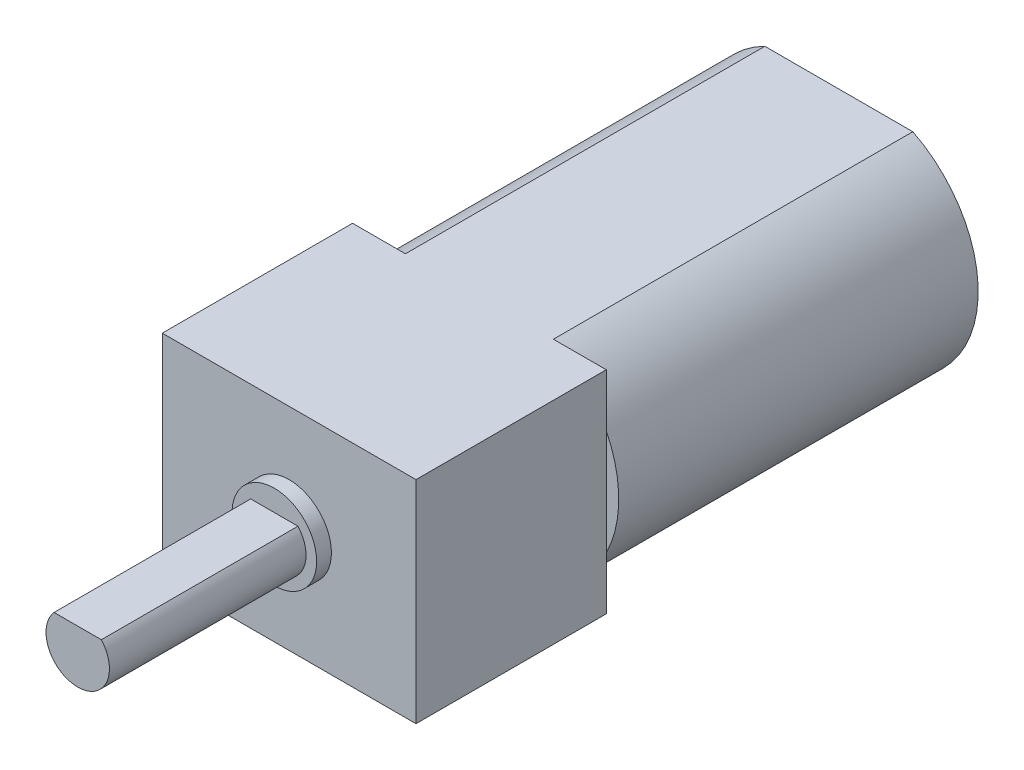
ISO-10303-21;
HEADER;
FILE_DESCRIPTION(('STEP AP214'),'2;1');
FILE_NAME('part.step','',(''),(''),'','','');
FILE_SCHEMA(('AUTOMOTIVE_DESIGN { 1 0 10303 214 1 1 1 1 }'));
ENDSEC;
DATA;
#1=APPLICATION_CONTEXT('core data for automotive mechanical design processes');
#2=APPLICATION_PROTOCOL_DEFINITION('international standard','automotive_design',2000,#1);
#3=PRODUCT_CONTEXT('',#1,'mechanical');
#4=PRODUCT('Part','Part','',(#3));
#5=PRODUCT_RELATED_PRODUCT_CATEGORY('part','',(#4));
#6=PRODUCT_DEFINITION_FORMATION('','',#4);
#7=PRODUCT_DEFINITION_CONTEXT('part definition',#1,'design');
#8=PRODUCT_DEFINITION('design','',#6,#7);
#9=PRODUCT_DEFINITION_SHAPE('','',#8);
#10=(LENGTH_UNIT() NAMED_UNIT(*) SI_UNIT(.MILLI.,.METRE.));
#11=(NAMED_UNIT(*) PLANE_ANGLE_UNIT() SI_UNIT($,.RADIAN.));
#12=(NAMED_UNIT(*) SI_UNIT($,.STERADIAN.) SOLID_ANGLE_UNIT());
#13=UNCERTAINTY_MEASURE_WITH_UNIT(LENGTH_MEASURE(1.E-05),#10,'distance_accuracy_value','');
#14=(GEOMETRIC_REPRESENTATION_CONTEXT(3) GLOBAL_UNCERTAINTY_ASSIGNED_CONTEXT((#13)) GLOBAL_UNIT_ASSIGNED_CONTEXT((#10,
#11,#12)) REPRESENTATION_CONTEXT('',''));
#15=CARTESIAN_POINT('',(0.,0.,0.));
#16=DIRECTION('',(0.,0.,1.));
#17=DIRECTION('',(1.,0.,0.));
#18=AXIS2_PLACEMENT_3D('',#15,#16,#17);
#19=CARTESIAN_POINT('',(-1.,0.,0.));
#20=DIRECTION('',(0.,0.,1.));
#21=DIRECTION('',(1.,0.,0.));
#22=AXIS2_PLACEMENT_3D('',#19,#20,#21);
#23=PLANE('',#22);
#24=DIRECTION('',(0.,1.,0.));
#25=VECTOR('',#24,1.);
#26=CARTESIAN_POINT('',(6.,5.,0.));
#27=LINE('',#26,#25);
#28=CARTESIAN_POINT('',(6.,-2.5,0.));
#29=VERTEX_POINT('',#28);
#30=CARTESIAN_POINT('',(6.,2.5,0.));
#31=VERTEX_POINT('',#30);
#32=EDGE_CURVE('E150',#29,#31,#27,.T.);
#33=ORIENTED_EDGE('',*,*,#32,.F.);
#34=CARTESIAN_POINT('',(1.,0.,0.));
#35=DIRECTION('',(0.,0.,1.));
#36=DIRECTION('',(-1.,0.,0.));
#37=AXIS2_PLACEMENT_3D('',#34,#35,#36);
#38=CIRCLE('',#37,5.59016994374947);
#39=EDGE_CURVE('E208',#29,#31,#38,.T.);
#40=ORIENTED_EDGE('',*,*,#39,.T.);
#41=EDGE_LOOP('',(#33,#40));
#42=FACE_BOUND('',#41,.T.);
#43=ADVANCED_FACE('F35',(#42),#23,.T.);
#44=CARTESIAN_POINT('',(-1.,0.,-17.));
#45=DIRECTION('',(0.,0.,1.));
#46=DIRECTION('',(1.,0.,0.));
#47=AXIS2_PLACEMENT_3D('',#44,#45,#46);
#48=CYLINDRICAL_SURFACE('',#47,5.59016994374947);
#49=CARTESIAN_POINT('',(-1.,0.,0.));
#50=DIRECTION('',(0.,0.,1.));
#51=DIRECTION('',(1.,0.,0.));
#52=AXIS2_PLACEMENT_3D('',#49,#50,#51);
#53=CIRCLE('',#52,5.59016994374947);
#54=CARTESIAN_POINT('',(-3.5,5.,0.));
#55=VERTEX_POINT('',#54);
#56=CARTESIAN_POINT('',(-6.,2.49999999999999,0.));
#57=VERTEX_POINT('',#56);
#58=EDGE_CURVE('E202',#55,#57,#53,.T.);
#59=ORIENTED_EDGE('',*,*,#58,.F.);
#60=DIRECTION('',(0.,0.,1.));
#61=VECTOR('',#60,1.);
#62=CARTESIAN_POINT('',(-3.5,5.,-17.));
#63=LINE('',#62,#61);
#64=CARTESIAN_POINT('',(-3.5,5.,-17.));
#65=VERTEX_POINT('',#64);
#66=EDGE_CURVE('E209',#65,#55,#63,.T.);
#67=ORIENTED_EDGE('',*,*,#66,.F.);
#68=CARTESIAN_POINT('',(-1.,0.,-17.));
#69=DIRECTION('',(0.,0.,1.));
#70=DIRECTION('',(1.,0.,0.));
#71=AXIS2_PLACEMENT_3D('',#68,#69,#70);
#72=CIRCLE('',#71,5.59016994374947);
#73=CARTESIAN_POINT('',(-3.5,-5.,-17.));
#74=VERTEX_POINT('',#73);
#75=EDGE_CURVE('E189',#65,#74,#72,.T.);
#76=ORIENTED_EDGE('',*,*,#75,.T.);
#77=DIRECTION('',(0.,0.,1.));
#78=VECTOR('',#77,1.);
#79=CARTESIAN_POINT('',(-3.5,-5.,-17.));
#80=LINE('',#79,#78);
#81=CARTESIAN_POINT('',(-3.5,-5.,0.));
#82=VERTEX_POINT('',#81);
#83=EDGE_CURVE('E39',#74,#82,#80,.T.);
#84=ORIENTED_EDGE('',*,*,#83,.T.);
#85=CARTESIAN_POINT('',(-6.,-2.5,0.));
#86=VERTEX_POINT('',#85);
#87=EDGE_CURVE('E188',#86,#82,#53,.T.);
#88=ORIENTED_EDGE('',*,*,#87,.F.);
#89=EDGE_CURVE('E205',#57,#86,#53,.T.);
#90=ORIENTED_EDGE('',*,*,#89,.F.);
#91=EDGE_LOOP('',(#59,#67,#76,#84,#88,#90));
#92=FACE_BOUND('',#91,.T.);
#93=ADVANCED_FACE('F37',(#92),#48,.T.);
#94=CARTESIAN_POINT('',(-3.5,5.,-17.));
#95=DIRECTION('',(0.,1.,0.));
#96=DIRECTION('',(0.,0.,1.));
#97=AXIS2_PLACEMENT_3D('',#94,#95,#96);
#98=PLANE('',#97);
#99=ORIENTED_EDGE('',*,*,#66,.T.);
#100=DIRECTION('',(-1.,0.,0.));
#101=VECTOR('',#100,1.);
#102=CARTESIAN_POINT('',(-6.,5.,0.));
#103=LINE('',#102,#101);
#104=CARTESIAN_POINT('',(-6.,5.,0.));
#105=VERTEX_POINT('',#104);
#106=EDGE_CURVE('E165',#55,#105,#103,.T.);
#107=ORIENTED_EDGE('',*,*,#106,.T.);
#108=DIRECTION('',(0.,0.,-1.));
#109=VECTOR('',#108,1.);
#110=CARTESIAN_POINT('',(-6.,5.,9.));
#111=LINE('',#110,#109);
#112=CARTESIAN_POINT('',(-6.,5.,9.));
#113=VERTEX_POINT('',#112);
#114=EDGE_CURVE('E182',#113,#105,#111,.T.);
#115=ORIENTED_EDGE('',*,*,#114,.F.);
#116=DIRECTION('',(-1.,0.,0.));
#117=VECTOR('',#116,1.);
#118=CARTESIAN_POINT('',(-6.,5.,9.));
#119=LINE('',#118,#117);
#120=CARTESIAN_POINT('',(6.,5.,9.));
#121=VERTEX_POINT('',#120);
#122=EDGE_CURVE('E154',#121,#113,#119,.T.);
#123=ORIENTED_EDGE('',*,*,#122,.F.);
#124=DIRECTION('',(0.,0.,-1.));
#125=VECTOR('',#124,1.);
#126=CARTESIAN_POINT('',(6.,5.,9.));
#127=LINE('',#126,#125);
#128=CARTESIAN_POINT('',(6.,5.,0.));
#129=VERTEX_POINT('',#128);
#130=EDGE_CURVE('E185',#121,#129,#127,.T.);
#131=ORIENTED_EDGE('',*,*,#130,.T.);
#132=CARTESIAN_POINT('',(3.5,5.,0.));
#133=VERTEX_POINT('',#132);
#134=EDGE_CURVE('E166',#129,#133,#103,.T.);
#135=ORIENTED_EDGE('',*,*,#134,.T.);
#136=DIRECTION('',(0.,0.,1.));
#137=VECTOR('',#136,1.);
#138=CARTESIAN_POINT('',(3.5,5.,-17.));
#139=LINE('',#138,#137);
#140=CARTESIAN_POINT('',(3.5,5.,-17.));
#141=VERTEX_POINT('',#140);
#142=EDGE_CURVE('E211',#141,#133,#139,.T.);
#143=ORIENTED_EDGE('',*,*,#142,.F.);
#144=DIRECTION('',(-1.,0.,0.));
#145=VECTOR('',#144,1.);
#146=CARTESIAN_POINT('',(-3.5,5.,-17.));
#147=LINE('',#146,#145);
#148=EDGE_CURVE('E199',#141,#65,#147,.T.);
#149=ORIENTED_EDGE('',*,*,#148,.T.);
#150=EDGE_LOOP('',(#99,#107,#115,#123,#131,#135,#143,#149));
#151=FACE_BOUND('',#150,.T.);
#152=ADVANCED_FACE('F244',(#151),#98,.T.);
#153=CARTESIAN_POINT('',(1.,0.,-17.));
#154=DIRECTION('',(0.,0.,1.));
#155=DIRECTION('',(1.,0.,0.));
#156=AXIS2_PLACEMENT_3D('',#153,#154,#155);
#157=CYLINDRICAL_SURFACE('',#156,5.59016994374947);
#158=CARTESIAN_POINT('',(3.5,-5.,0.));
#159=VERTEX_POINT('',#158);
#160=EDGE_CURVE('E193',#159,#29,#38,.T.);
#161=ORIENTED_EDGE('',*,*,#160,.F.);
#162=DIRECTION('',(0.,0.,1.));
#163=VECTOR('',#162,1.);
#164=CARTESIAN_POINT('',(3.5,-5.,-17.));
#165=LINE('',#164,#163);
#166=CARTESIAN_POINT('',(3.5,-5.,-17.));
#167=VERTEX_POINT('',#166);
#168=EDGE_CURVE('E212',#167,#159,#165,.T.);
#169=ORIENTED_EDGE('',*,*,#168,.F.);
#170=CARTESIAN_POINT('',(1.,0.,-17.));
#171=DIRECTION('',(0.,0.,1.));
#172=DIRECTION('',(-1.,0.,0.));
#173=AXIS2_PLACEMENT_3D('',#170,#171,#172);
#174=CIRCLE('',#173,5.59016994374947);
#175=EDGE_CURVE('E196',#167,#141,#174,.T.);
#176=ORIENTED_EDGE('',*,*,#175,.T.);
#177=ORIENTED_EDGE('',*,*,#142,.T.);
#178=EDGE_CURVE('E60',#31,#133,#38,.T.);
#179=ORIENTED_EDGE('',*,*,#178,.F.);
#180=ORIENTED_EDGE('',*,*,#39,.F.);
#181=EDGE_LOOP('',(#161,#169,#176,#177,#179,#180));
#182=FACE_BOUND('',#181,.T.);
#183=ADVANCED_FACE('F252',(#182),#157,.T.);
#184=CARTESIAN_POINT('',(-3.5,-5.,-17.));
#185=DIRECTION('',(0.,-1.,0.));
#186=DIRECTION('',(0.,0.,-1.));
#187=AXIS2_PLACEMENT_3D('',#184,#185,#186);
#188=PLANE('',#187);
#189=ORIENTED_EDGE('',*,*,#168,.T.);
#190=DIRECTION('',(1.,0.,0.));
#191=VECTOR('',#190,1.);
#192=CARTESIAN_POINT('',(-6.,-5.,0.));
#193=LINE('',#192,#191);
#194=CARTESIAN_POINT('',(6.,-5.,0.));
#195=VERTEX_POINT('',#194);
#196=EDGE_CURVE('E173',#159,#195,#193,.T.);
#197=ORIENTED_EDGE('',*,*,#196,.T.);
#198=DIRECTION('',(0.,0.,-1.));
#199=VECTOR('',#198,1.);
#200=CARTESIAN_POINT('',(6.,-5.,9.));
#201=LINE('',#200,#199);
#202=CARTESIAN_POINT('',(6.,-5.,9.));
#203=VERTEX_POINT('',#202);
#204=EDGE_CURVE('E161',#203,#195,#201,.T.);
#205=ORIENTED_EDGE('',*,*,#204,.F.);
#206=DIRECTION('',(1.,0.,0.));
#207=VECTOR('',#206,1.);
#208=CARTESIAN_POINT('',(-6.,-5.,9.));
#209=LINE('',#208,#207);
#210=CARTESIAN_POINT('',(-6.,-5.,9.));
#211=VERTEX_POINT('',#210);
#212=EDGE_CURVE('E159',#211,#203,#209,.T.);
#213=ORIENTED_EDGE('',*,*,#212,.F.);
#214=DIRECTION('',(0.,0.,-1.));
#215=VECTOR('',#214,1.);
#216=CARTESIAN_POINT('',(-6.,-5.,9.));
#217=LINE('',#216,#215);
#218=CARTESIAN_POINT('',(-6.,-5.,0.));
#219=VERTEX_POINT('',#218);
#220=EDGE_CURVE('E179',#211,#219,#217,.T.);
#221=ORIENTED_EDGE('',*,*,#220,.T.);
#222=EDGE_CURVE('E155',#219,#82,#193,.T.);
#223=ORIENTED_EDGE('',*,*,#222,.T.);
#224=ORIENTED_EDGE('',*,*,#83,.F.);
#225=DIRECTION('',(1.,0.,0.));
#226=VECTOR('',#225,1.);
#227=CARTESIAN_POINT('',(-3.5,-5.,-17.));
#228=LINE('',#227,#226);
#229=EDGE_CURVE('E192',#74,#167,#228,.T.);
#230=ORIENTED_EDGE('',*,*,#229,.T.);
#231=EDGE_LOOP('',(#189,#197,#205,#213,#221,#223,#224,#230));
#232=FACE_BOUND('',#231,.T.);
#233=ADVANCED_FACE('F227',(#232),#188,.T.);
#234=CARTESIAN_POINT('',(-1.,0.,-17.));
#235=DIRECTION('',(0.,0.,1.));
#236=DIRECTION('',(1.,0.,0.));
#237=AXIS2_PLACEMENT_3D('',#234,#235,#236);
#238=PLANE('',#237);
#239=ORIENTED_EDGE('',*,*,#75,.F.);
#240=ORIENTED_EDGE('',*,*,#148,.F.);
#241=ORIENTED_EDGE('',*,*,#175,.F.);
#242=ORIENTED_EDGE('',*,*,#229,.F.);
#243=EDGE_LOOP('',(#239,#240,#241,#242));
#244=FACE_BOUND('',#243,.T.);
#245=ADVANCED_FACE('F265',(#244),#238,.F.);
#246=DIRECTION('',(0.,-1.,0.));
#247=VECTOR('',#246,1.);
#248=CARTESIAN_POINT('',(-6.,5.,0.));
#249=LINE('',#248,#247);
#250=EDGE_CURVE('E174',#57,#86,#249,.T.);
#251=ORIENTED_EDGE('',*,*,#250,.F.);
#252=ORIENTED_EDGE('',*,*,#89,.T.);
#253=EDGE_LOOP('',(#251,#252));
#254=FACE_BOUND('',#253,.T.);
#255=ADVANCED_FACE('F257',(#254),#23,.T.);
#256=CARTESIAN_POINT('',(0.,0.,0.));
#257=DIRECTION('',(0.,0.,1.));
#258=DIRECTION('',(1.,0.,0.));
#259=AXIS2_PLACEMENT_3D('',#256,#257,#258);
#260=PLANE('',#259);
#261=ORIENTED_EDGE('',*,*,#106,.F.);
#262=ORIENTED_EDGE('',*,*,#58,.T.);
#263=EDGE_CURVE('E170',#105,#57,#249,.T.);
#264=ORIENTED_EDGE('',*,*,#263,.F.);
#265=EDGE_LOOP('',(#261,#262,#264));
#266=FACE_BOUND('',#265,.T.);
#267=ADVANCED_FACE('F264',(#266),#260,.F.);
#268=EDGE_CURVE('E169',#86,#219,#249,.T.);
#269=ORIENTED_EDGE('',*,*,#268,.F.);
#270=ORIENTED_EDGE('',*,*,#87,.T.);
#271=ORIENTED_EDGE('',*,*,#222,.F.);
#272=EDGE_LOOP('',(#269,#270,#271));
#273=FACE_BOUND('',#272,.T.);
#274=ADVANCED_FACE('F225',(#273),#260,.F.);
#275=ORIENTED_EDGE('',*,*,#196,.F.);
#276=ORIENTED_EDGE('',*,*,#160,.T.);
#277=EDGE_CURVE('E162',#195,#29,#27,.T.);
#278=ORIENTED_EDGE('',*,*,#277,.F.);
#279=EDGE_LOOP('',(#275,#276,#278));
#280=FACE_BOUND('',#279,.T.);
#281=ADVANCED_FACE('F251',(#280),#260,.F.);
#282=EDGE_CURVE('E143',#31,#129,#27,.T.);
#283=ORIENTED_EDGE('',*,*,#282,.F.);
#284=ORIENTED_EDGE('',*,*,#178,.T.);
#285=ORIENTED_EDGE('',*,*,#134,.F.);
#286=EDGE_LOOP('',(#283,#284,#285));
#287=FACE_BOUND('',#286,.T.);
#288=ADVANCED_FACE('F242',(#287),#260,.F.);
#289=CARTESIAN_POINT('',(6.,5.,9.));
#290=DIRECTION('',(-1.,0.,0.));
#291=DIRECTION('',(0.,-1.,0.));
#292=AXIS2_PLACEMENT_3D('',#289,#290,#291);
#293=PLANE('',#292);
#294=ORIENTED_EDGE('',*,*,#277,.T.);
#295=ORIENTED_EDGE('',*,*,#32,.T.);
#296=ORIENTED_EDGE('',*,*,#282,.T.);
#297=ORIENTED_EDGE('',*,*,#130,.F.);
#298=DIRECTION('',(0.,1.,0.));
#299=VECTOR('',#298,1.);
#300=CARTESIAN_POINT('',(6.,5.,9.));
#301=LINE('',#300,#299);
#302=EDGE_CURVE('E151',#203,#121,#301,.T.);
#303=ORIENTED_EDGE('',*,*,#302,.F.);
#304=ORIENTED_EDGE('',*,*,#204,.T.);
#305=EDGE_LOOP('',(#294,#295,#296,#297,#303,#304));
#306=FACE_BOUND('',#305,.T.);
#307=ADVANCED_FACE('F239',(#306),#293,.F.);
#308=CARTESIAN_POINT('',(-6.,5.,9.));
#309=DIRECTION('',(1.,0.,0.));
#310=DIRECTION('',(0.,1.,0.));
#311=AXIS2_PLACEMENT_3D('',#308,#309,#310);
#312=PLANE('',#311);
#313=ORIENTED_EDGE('',*,*,#263,.T.);
#314=ORIENTED_EDGE('',*,*,#250,.T.);
#315=ORIENTED_EDGE('',*,*,#268,.T.);
#316=ORIENTED_EDGE('',*,*,#220,.F.);
#317=DIRECTION('',(0.,-1.,0.));
#318=VECTOR('',#317,1.);
#319=CARTESIAN_POINT('',(-6.,5.,9.));
#320=LINE('',#319,#318);
#321=EDGE_CURVE('E157',#113,#211,#320,.T.);
#322=ORIENTED_EDGE('',*,*,#321,.F.);
#323=ORIENTED_EDGE('',*,*,#114,.T.);
#324=EDGE_LOOP('',(#313,#314,#315,#316,#322,#323));
#325=FACE_BOUND('',#324,.T.);
#326=ADVANCED_FACE('F233',(#325),#312,.F.);
#327=CARTESIAN_POINT('',(0.,0.,9.));
#328=DIRECTION('',(0.,0.,1.));
#329=DIRECTION('',(1.,0.,0.));
#330=AXIS2_PLACEMENT_3D('',#327,#328,#329);
#331=PLANE('',#330);
#332=CARTESIAN_POINT('',(0.,0.,9.));
#333=DIRECTION('',(0.,0.,1.));
#334=DIRECTION('',(1.,0.,0.));
#335=AXIS2_PLACEMENT_3D('',#332,#333,#334);
#336=CIRCLE('',#335,2.);
#337=CARTESIAN_POINT('',(2.,0.,9.));
#338=VERTEX_POINT('',#337);
#339=EDGE_CURVE('E44',#338,#338,#336,.T.);
#340=ORIENTED_EDGE('',*,*,#339,.F.);
#341=EDGE_LOOP('',(#340));
#342=FACE_BOUND('',#341,.T.);
#343=ORIENTED_EDGE('',*,*,#302,.T.);
#344=ORIENTED_EDGE('',*,*,#122,.T.);
#345=ORIENTED_EDGE('',*,*,#321,.T.);
#346=ORIENTED_EDGE('',*,*,#212,.T.);
#347=EDGE_LOOP('',(#343,#344,#345,#346));
#348=FACE_BOUND('',#347,.T.);
#349=ADVANCED_FACE('F247',(#342,#348),#331,.T.);
#350=CARTESIAN_POINT('',(0.,0.,9.7));
#351=DIRECTION('',(0.,0.,-1.));
#352=DIRECTION('',(-1.,0.,0.));
#353=AXIS2_PLACEMENT_3D('',#350,#351,#352);
#354=CYLINDRICAL_SURFACE('',#353,2.);
#355=CARTESIAN_POINT('',(0.,0.,9.7));
#356=DIRECTION('',(0.,0.,1.));
#357=DIRECTION('',(1.,0.,0.));
#358=AXIS2_PLACEMENT_3D('',#355,#356,#357);
#359=CIRCLE('',#358,2.);
#360=CARTESIAN_POINT('',(2.,0.,9.7));
#361=VERTEX_POINT('',#360);
#362=EDGE_CURVE('E140',#361,#361,#359,.T.);
#363=ORIENTED_EDGE('',*,*,#362,.F.);
#364=EDGE_LOOP('',(#363));
#365=FACE_BOUND('',#364,.T.);
#366=ORIENTED_EDGE('',*,*,#339,.T.);
#367=EDGE_LOOP('',(#366));
#368=FACE_BOUND('',#367,.T.);
#369=ADVANCED_FACE('F287',(#365,#368),#354,.T.);
#370=CARTESIAN_POINT('',(0.,0.,9.7));
#371=DIRECTION('',(0.,0.,1.));
#372=DIRECTION('',(1.,0.,0.));
#373=AXIS2_PLACEMENT_3D('',#370,#371,#372);
#374=PLANE('',#373);
#375=CARTESIAN_POINT('',(0.,0.,9.7));
#376=DIRECTION('',(0.,0.,1.));
#377=DIRECTION('',(1.,0.,0.));
#378=AXIS2_PLACEMENT_3D('',#375,#376,#377);
#379=CIRCLE('',#378,1.5);
#380=CARTESIAN_POINT('',(-1.1180339887499,1.,9.7));
#381=VERTEX_POINT('',#380);
#382=CARTESIAN_POINT('',(1.1180339887499,1.,9.7));
#383=VERTEX_POINT('',#382);
#384=EDGE_CURVE('E11',#381,#383,#379,.T.);
#385=ORIENTED_EDGE('',*,*,#384,.F.);
#386=DIRECTION('',(-1.,0.,0.));
#387=VECTOR('',#386,1.);
#388=CARTESIAN_POINT('',(-1.1180339887499,1.,9.7));
#389=LINE('',#388,#387);
#390=EDGE_CURVE('E137',#383,#381,#389,.T.);
#391=ORIENTED_EDGE('',*,*,#390,.F.);
#392=EDGE_LOOP('',(#385,#391));
#393=FACE_BOUND('',#392,.T.);
#394=ORIENTED_EDGE('',*,*,#362,.T.);
#395=EDGE_LOOP('',(#394));
#396=FACE_BOUND('',#395,.T.);
#397=ADVANCED_FACE('F291',(#393,#396),#374,.T.);
#398=CARTESIAN_POINT('',(0.,0.,19.));
#399=DIRECTION('',(0.,0.,-1.));
#400=DIRECTION('',(-1.,0.,0.));
#401=AXIS2_PLACEMENT_3D('',#398,#399,#400);
#402=CYLINDRICAL_SURFACE('',#401,1.5);
#403=CARTESIAN_POINT('',(0.,0.,19.));
#404=DIRECTION('',(0.,0.,1.));
#405=DIRECTION('',(1.,0.,0.));
#406=AXIS2_PLACEMENT_3D('',#403,#404,#405);
#407=CIRCLE('',#406,1.5);
#408=CARTESIAN_POINT('',(-1.1180339887499,1.,19.));
#409=VERTEX_POINT('',#408);
#410=CARTESIAN_POINT('',(1.1180339887499,1.,19.));
#411=VERTEX_POINT('',#410);
#412=EDGE_CURVE('E135',#409,#411,#407,.T.);
#413=ORIENTED_EDGE('',*,*,#412,.F.);
#414=DIRECTION('',(0.,0.,1.));
#415=VECTOR('',#414,1.);
#416=CARTESIAN_POINT('',(-1.1180339887499,1.,7.40871215252208));
#417=LINE('',#416,#415);
#418=EDGE_CURVE('E52',#381,#409,#417,.T.);
#419=ORIENTED_EDGE('',*,*,#418,.F.);
#420=ORIENTED_EDGE('',*,*,#384,.T.);
#421=DIRECTION('',(0.,0.,1.));
#422=VECTOR('',#421,1.);
#423=CARTESIAN_POINT('',(1.1180339887499,1.,7.40871215252208));
#424=LINE('',#423,#422);
#425=EDGE_CURVE('E127',#383,#411,#424,.T.);
#426=ORIENTED_EDGE('',*,*,#425,.T.);
#427=EDGE_LOOP('',(#413,#419,#420,#426));
#428=FACE_BOUND('',#427,.T.);
#429=ADVANCED_FACE('F134',(#428),#402,.T.);
#430=CARTESIAN_POINT('',(0.,0.,19.));
#431=DIRECTION('',(0.,0.,1.));
#432=DIRECTION('',(1.,0.,0.));
#433=AXIS2_PLACEMENT_3D('',#430,#431,#432);
#434=PLANE('',#433);
#435=DIRECTION('',(1.,0.,0.));
#436=VECTOR('',#435,1.);
#437=CARTESIAN_POINT('',(-1.1180339887499,1.,19.));
#438=LINE('',#437,#436);
#439=EDGE_CURVE('E124',#409,#411,#438,.T.);
#440=ORIENTED_EDGE('',*,*,#439,.F.);
#441=ORIENTED_EDGE('',*,*,#412,.T.);
#442=EDGE_LOOP('',(#440,#441));
#443=FACE_BOUND('',#442,.T.);
#444=ADVANCED_FACE('F139',(#443),#434,.T.);
#445=CARTESIAN_POINT('',(-1.1180339887499,1.,7.40871215252208));
#446=DIRECTION('',(0.,-1.,0.));
#447=DIRECTION('',(0.,0.,-1.));
#448=AXIS2_PLACEMENT_3D('',#445,#446,#447);
#449=PLANE('',#448);
#450=ORIENTED_EDGE('',*,*,#390,.T.);
#451=ORIENTED_EDGE('',*,*,#418,.T.);
#452=ORIENTED_EDGE('',*,*,#439,.T.);
#453=ORIENTED_EDGE('',*,*,#425,.F.);
#454=EDGE_LOOP('',(#450,#451,#452,#453));
#455=FACE_BOUND('',#454,.T.);
#456=ADVANCED_FACE('F126',(#455),#449,.F.);
#457=CLOSED_SHELL('',(#43,#93,#152,#183,#233,#245,#255,#267,#274,#281,#288,#307,#326,#349,#369,
#397,#429,#444,#456));
#458=MANIFOLD_SOLID_BREP('B2',#457);
#459=ADVANCED_BREP_SHAPE_REPRESENTATION('',(#18,#458),#14);
#460=SHAPE_DEFINITION_REPRESENTATION(#9,#459);
ENDSEC;
END-ISO-10303-21;
